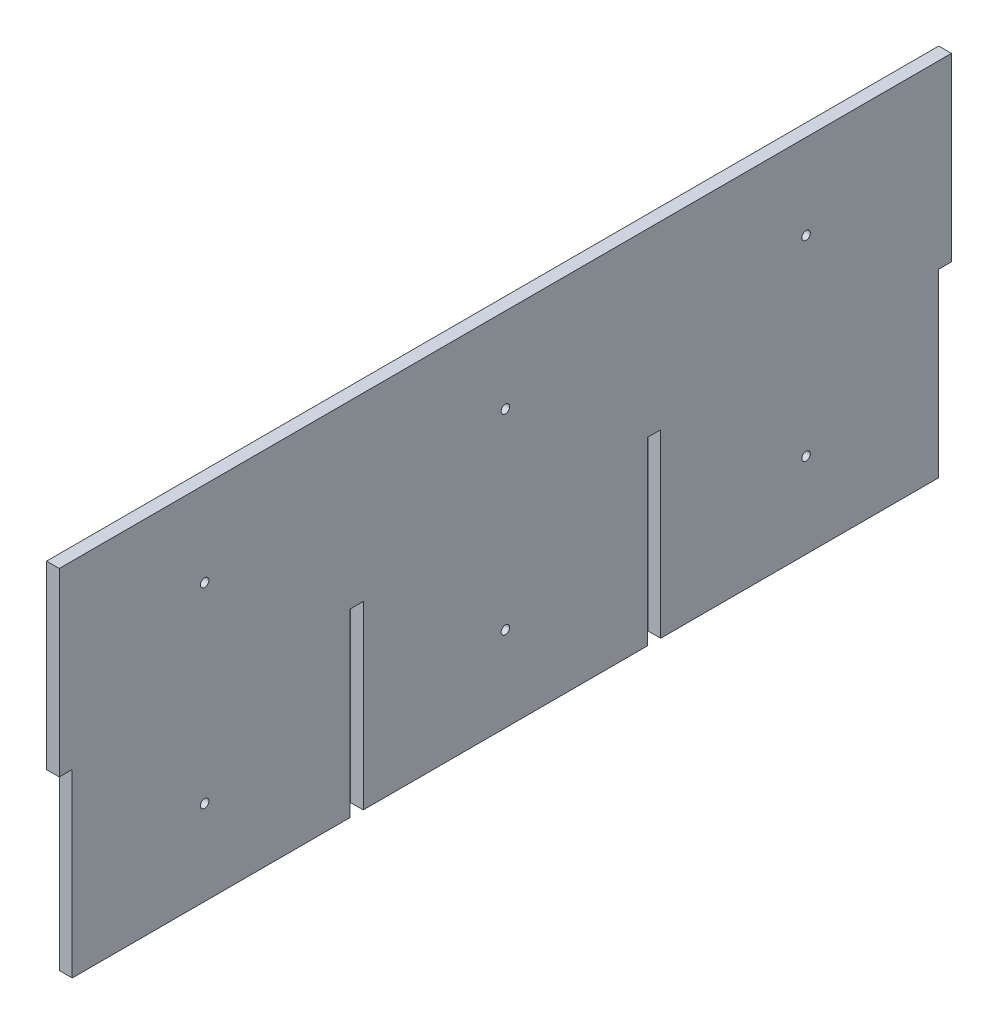
ISO-10303-21;
HEADER;
FILE_DESCRIPTION(('STEP AP214'),'2;1');
FILE_NAME('part.step','',(''),(''),'','','');
FILE_SCHEMA(('AUTOMOTIVE_DESIGN { 1 0 10303 214 1 1 1 1 }'));
ENDSEC;
DATA;
#1=APPLICATION_CONTEXT('core data for automotive mechanical design processes');
#2=APPLICATION_PROTOCOL_DEFINITION('international standard','automotive_design',2000,#1);
#3=PRODUCT_CONTEXT('',#1,'mechanical');
#4=PRODUCT('Part','Part','',(#3));
#5=PRODUCT_RELATED_PRODUCT_CATEGORY('part','',(#4));
#6=PRODUCT_DEFINITION_FORMATION('','',#4);
#7=PRODUCT_DEFINITION_CONTEXT('part definition',#1,'design');
#8=PRODUCT_DEFINITION('design','',#6,#7);
#9=PRODUCT_DEFINITION_SHAPE('','',#8);
#10=(LENGTH_UNIT() NAMED_UNIT(*) SI_UNIT(.MILLI.,.METRE.));
#11=(NAMED_UNIT(*) PLANE_ANGLE_UNIT() SI_UNIT($,.RADIAN.));
#12=(NAMED_UNIT(*) SI_UNIT($,.STERADIAN.) SOLID_ANGLE_UNIT());
#13=UNCERTAINTY_MEASURE_WITH_UNIT(LENGTH_MEASURE(1.E-05),#10,'distance_accuracy_value','');
#14=(GEOMETRIC_REPRESENTATION_CONTEXT(3) GLOBAL_UNCERTAINTY_ASSIGNED_CONTEXT((#13)) GLOBAL_UNIT_ASSIGNED_CONTEXT((#10,
#11,#12)) REPRESENTATION_CONTEXT('',''));
#15=CARTESIAN_POINT('',(0.,0.,0.));
#16=DIRECTION('',(0.,0.,1.));
#17=DIRECTION('',(1.,0.,0.));
#18=AXIS2_PLACEMENT_3D('',#15,#16,#17);
#19=CARTESIAN_POINT('',(6.,246.915861829284,-230.911700257926));
#20=DIRECTION('',(0.,-1.,0.));
#21=DIRECTION('',(0.,0.,-1.));
#22=AXIS2_PLACEMENT_3D('',#19,#20,#21);
#23=PLANE('',#22);
#24=DIRECTION('',(-1.,0.,0.));
#25=VECTOR('',#24,1.);
#26=CARTESIAN_POINT('',(6.,246.915861829284,-230.911700257926));
#27=LINE('',#26,#25);
#28=CARTESIAN_POINT('',(6.,246.915861829284,-230.911700257926));
#29=VERTEX_POINT('',#28);
#30=CARTESIAN_POINT('',(0.,246.915861829284,-230.911700257926));
#31=VERTEX_POINT('',#30);
#32=EDGE_CURVE('E289',#29,#31,#27,.T.);
#33=ORIENTED_EDGE('',*,*,#32,.F.);
#34=DIRECTION('',(0.,0.,1.));
#35=VECTOR('',#34,1.);
#36=CARTESIAN_POINT('',(6.,246.915861829284,-230.911700257926));
#37=LINE('',#36,#35);
#38=CARTESIAN_POINT('',(6.,246.915861829284,-650.911700257926));
#39=VERTEX_POINT('',#38);
#40=EDGE_CURVE('E287',#39,#29,#37,.T.);
#41=ORIENTED_EDGE('',*,*,#40,.F.);
#42=DIRECTION('',(-1.,0.,0.));
#43=VECTOR('',#42,1.);
#44=CARTESIAN_POINT('',(6.,246.915861829284,-650.911700257926));
#45=LINE('',#44,#43);
#46=CARTESIAN_POINT('',(0.,246.915861829284,-650.911700257926));
#47=VERTEX_POINT('',#46);
#48=EDGE_CURVE('E299',#39,#47,#45,.T.);
#49=ORIENTED_EDGE('',*,*,#48,.T.);
#50=DIRECTION('',(0.,0.,1.));
#51=VECTOR('',#50,1.);
#52=CARTESIAN_POINT('',(0.,246.915861829284,-230.911700257926));
#53=LINE('',#52,#51);
#54=EDGE_CURVE('E282',#47,#31,#53,.T.);
#55=ORIENTED_EDGE('',*,*,#54,.T.);
#56=EDGE_LOOP('',(#33,#41,#49,#55));
#57=FACE_BOUND('',#56,.T.);
#58=ADVANCED_FACE('F33',(#57),#23,.F.);
#59=CARTESIAN_POINT('',(6.,76.915861829284,-230.911700257926));
#60=DIRECTION('',(0.,1.,0.));
#61=DIRECTION('',(0.,0.,1.));
#62=AXIS2_PLACEMENT_3D('',#59,#60,#61);
#63=PLANE('',#62);
#64=DIRECTION('',(0.,0.,-1.));
#65=VECTOR('',#64,1.);
#66=CARTESIAN_POINT('',(6.,76.915861829284,-230.911700257926));
#67=LINE('',#66,#65);
#68=CARTESIAN_POINT('',(6.,76.915861829284,-514.011700257926));
#69=VERTEX_POINT('',#68);
#70=CARTESIAN_POINT('',(6.,76.915861829284,-644.811700257926));
#71=VERTEX_POINT('',#70);
#72=EDGE_CURVE('E281',#69,#71,#67,.T.);
#73=ORIENTED_EDGE('',*,*,#72,.F.);
#74=DIRECTION('',(1.,0.,0.));
#75=VECTOR('',#74,1.);
#76=CARTESIAN_POINT('',(-107.,76.915861829284,-514.011700257926));
#77=LINE('',#76,#75);
#78=CARTESIAN_POINT('',(0.,76.915861829284,-514.011700257926));
#79=VERTEX_POINT('',#78);
#80=EDGE_CURVE('E11',#79,#69,#77,.T.);
#81=ORIENTED_EDGE('',*,*,#80,.F.);
#82=DIRECTION('',(0.,0.,-1.));
#83=VECTOR('',#82,1.);
#84=CARTESIAN_POINT('',(0.,76.915861829284,-230.911700257926));
#85=LINE('',#84,#83);
#86=CARTESIAN_POINT('',(0.,76.915861829284,-644.811700257926));
#87=VERTEX_POINT('',#86);
#88=EDGE_CURVE('E292',#79,#87,#85,.T.);
#89=ORIENTED_EDGE('',*,*,#88,.T.);
#90=DIRECTION('',(1.,0.,0.));
#91=VECTOR('',#90,1.);
#92=CARTESIAN_POINT('',(0.,76.915861829284,-644.811700257926));
#93=LINE('',#92,#91);
#94=EDGE_CURVE('E253',#87,#71,#93,.T.);
#95=ORIENTED_EDGE('',*,*,#94,.T.);
#96=EDGE_LOOP('',(#73,#81,#89,#95));
#97=FACE_BOUND('',#96,.T.);
#98=ADVANCED_FACE('F318',(#97),#63,.F.);
#99=CARTESIAN_POINT('',(0.,76.915861829284,-237.011700257926));
#100=VERTEX_POINT('',#99);
#101=CARTESIAN_POINT('',(0.,76.915861829284,-367.811700257926));
#102=VERTEX_POINT('',#101);
#103=EDGE_CURVE('E48',#100,#102,#85,.T.);
#104=ORIENTED_EDGE('',*,*,#103,.T.);
#105=DIRECTION('',(-1.,0.,0.));
#106=VECTOR('',#105,1.);
#107=CARTESIAN_POINT('',(-107.,76.915861829284,-367.811700257926));
#108=LINE('',#107,#106);
#109=CARTESIAN_POINT('',(6.,76.915861829284,-367.811700257926));
#110=VERTEX_POINT('',#109);
#111=EDGE_CURVE('E170',#110,#102,#108,.T.);
#112=ORIENTED_EDGE('',*,*,#111,.F.);
#113=CARTESIAN_POINT('',(6.,76.915861829284,-237.011700257926));
#114=VERTEX_POINT('',#113);
#115=EDGE_CURVE('E283',#114,#110,#67,.T.);
#116=ORIENTED_EDGE('',*,*,#115,.F.);
#117=DIRECTION('',(1.,0.,0.));
#118=VECTOR('',#117,1.);
#119=CARTESIAN_POINT('',(0.,76.915861829284,-237.011700257926));
#120=LINE('',#119,#118);
#121=EDGE_CURVE('E267',#100,#114,#120,.T.);
#122=ORIENTED_EDGE('',*,*,#121,.F.);
#123=EDGE_LOOP('',(#104,#112,#116,#122));
#124=FACE_BOUND('',#123,.T.);
#125=ADVANCED_FACE('F347',(#124),#63,.F.);
#126=CARTESIAN_POINT('',(6.,76.915861829284,-230.911700257926));
#127=DIRECTION('',(0.,0.,-1.));
#128=DIRECTION('',(-1.,0.,0.));
#129=AXIS2_PLACEMENT_3D('',#126,#127,#128);
#130=PLANE('',#129);
#131=DIRECTION('',(0.,-1.,0.));
#132=VECTOR('',#131,1.);
#133=CARTESIAN_POINT('',(0.,76.915861829284,-230.911700257926));
#134=LINE('',#133,#132);
#135=CARTESIAN_POINT('',(0.,161.915861829284,-230.911700257926));
#136=VERTEX_POINT('',#135);
#137=EDGE_CURVE('E274',#31,#136,#134,.T.);
#138=ORIENTED_EDGE('',*,*,#137,.T.);
#139=DIRECTION('',(1.,0.,0.));
#140=VECTOR('',#139,1.);
#141=CARTESIAN_POINT('',(0.,161.915861829284,-230.911700257926));
#142=LINE('',#141,#140);
#143=CARTESIAN_POINT('',(6.,161.915861829284,-230.911700257926));
#144=VERTEX_POINT('',#143);
#145=EDGE_CURVE('E271',#136,#144,#142,.T.);
#146=ORIENTED_EDGE('',*,*,#145,.T.);
#147=DIRECTION('',(0.,-1.,0.));
#148=VECTOR('',#147,1.);
#149=CARTESIAN_POINT('',(6.,76.915861829284,-230.911700257926));
#150=LINE('',#149,#148);
#151=EDGE_CURVE('E278',#29,#144,#150,.T.);
#152=ORIENTED_EDGE('',*,*,#151,.F.);
#153=ORIENTED_EDGE('',*,*,#32,.T.);
#154=EDGE_LOOP('',(#138,#146,#152,#153));
#155=FACE_BOUND('',#154,.T.);
#156=ADVANCED_FACE('F35',(#155),#130,.F.);
#157=CARTESIAN_POINT('',(6.,76.915861829284,-650.911700257926));
#158=DIRECTION('',(0.,0.,1.));
#159=DIRECTION('',(1.,0.,0.));
#160=AXIS2_PLACEMENT_3D('',#157,#158,#159);
#161=PLANE('',#160);
#162=DIRECTION('',(0.,1.,0.));
#163=VECTOR('',#162,1.);
#164=CARTESIAN_POINT('',(6.,76.915861829284,-650.911700257926));
#165=LINE('',#164,#163);
#166=CARTESIAN_POINT('',(6.,161.915861829284,-650.911700257926));
#167=VERTEX_POINT('',#166);
#168=EDGE_CURVE('E285',#167,#39,#165,.T.);
#169=ORIENTED_EDGE('',*,*,#168,.F.);
#170=DIRECTION('',(1.,0.,0.));
#171=VECTOR('',#170,1.);
#172=CARTESIAN_POINT('',(0.,161.915861829284,-650.911700257926));
#173=LINE('',#172,#171);
#174=CARTESIAN_POINT('',(0.,161.915861829284,-650.911700257926));
#175=VERTEX_POINT('',#174);
#176=EDGE_CURVE('E248',#175,#167,#173,.T.);
#177=ORIENTED_EDGE('',*,*,#176,.F.);
#178=DIRECTION('',(0.,1.,0.));
#179=VECTOR('',#178,1.);
#180=CARTESIAN_POINT('',(0.,76.915861829284,-650.911700257926));
#181=LINE('',#180,#179);
#182=EDGE_CURVE('E294',#175,#47,#181,.T.);
#183=ORIENTED_EDGE('',*,*,#182,.T.);
#184=ORIENTED_EDGE('',*,*,#48,.F.);
#185=EDGE_LOOP('',(#169,#177,#183,#184));
#186=FACE_BOUND('',#185,.T.);
#187=ADVANCED_FACE('F330',(#186),#161,.F.);
#188=CARTESIAN_POINT('',(6.,0.,0.));
#189=DIRECTION('',(-1.,0.,0.));
#190=DIRECTION('',(0.,0.,1.));
#191=AXIS2_PLACEMENT_3D('',#188,#189,#190);
#192=PLANE('',#191);
#193=ORIENTED_EDGE('',*,*,#115,.T.);
#194=DIRECTION('',(0.,-1.,0.));
#195=VECTOR('',#194,1.);
#196=CARTESIAN_POINT('',(6.,48.915861829284,-367.811700257926));
#197=LINE('',#196,#195);
#198=CARTESIAN_POINT('',(6.,161.915861829284,-367.811700257926));
#199=VERTEX_POINT('',#198);
#200=EDGE_CURVE('E187',#199,#110,#197,.T.);
#201=ORIENTED_EDGE('',*,*,#200,.F.);
#202=DIRECTION('',(0.,0.,1.));
#203=VECTOR('',#202,1.);
#204=CARTESIAN_POINT('',(6.,161.915861829284,-367.811700257926));
#205=LINE('',#204,#203);
#206=CARTESIAN_POINT('',(6.,161.915861829284,-374.011700257926));
#207=VERTEX_POINT('',#206);
#208=EDGE_CURVE('E191',#207,#199,#205,.T.);
#209=ORIENTED_EDGE('',*,*,#208,.F.);
#210=DIRECTION('',(0.,1.,0.));
#211=VECTOR('',#210,1.);
#212=CARTESIAN_POINT('',(6.,48.915861829284,-374.011700257926));
#213=LINE('',#212,#211);
#214=CARTESIAN_POINT('',(6.,76.915861829284,-374.011700257926));
#215=VERTEX_POINT('',#214);
#216=EDGE_CURVE('E163',#215,#207,#213,.T.);
#217=ORIENTED_EDGE('',*,*,#216,.F.);
#218=DIRECTION('',(0.,0.,1.));
#219=VECTOR('',#218,1.);
#220=CARTESIAN_POINT('',(6.,76.915861829284,-1250.91170025793));
#221=LINE('',#220,#219);
#222=CARTESIAN_POINT('',(6.,76.915861829284,-507.811700257926));
#223=VERTEX_POINT('',#222);
#224=EDGE_CURVE('E148',#223,#215,#221,.T.);
#225=ORIENTED_EDGE('',*,*,#224,.F.);
#226=DIRECTION('',(0.,-1.,0.));
#227=VECTOR('',#226,1.);
#228=CARTESIAN_POINT('',(6.,48.915861829284,-507.811700257926));
#229=LINE('',#228,#227);
#230=CARTESIAN_POINT('',(6.,161.915861829284,-507.811700257926));
#231=VERTEX_POINT('',#230);
#232=EDGE_CURVE('E161',#231,#223,#229,.T.);
#233=ORIENTED_EDGE('',*,*,#232,.F.);
#234=DIRECTION('',(0.,0.,1.));
#235=VECTOR('',#234,1.);
#236=CARTESIAN_POINT('',(6.,161.915861829284,-507.811700257926));
#237=LINE('',#236,#235);
#238=CARTESIAN_POINT('',(6.,161.915861829284,-514.011700257926));
#239=VERTEX_POINT('',#238);
#240=EDGE_CURVE('E172',#239,#231,#237,.T.);
#241=ORIENTED_EDGE('',*,*,#240,.F.);
#242=DIRECTION('',(0.,1.,0.));
#243=VECTOR('',#242,1.);
#244=CARTESIAN_POINT('',(6.,48.915861829284,-514.011700257926));
#245=LINE('',#244,#243);
#246=EDGE_CURVE('E169',#69,#239,#245,.T.);
#247=ORIENTED_EDGE('',*,*,#246,.F.);
#248=ORIENTED_EDGE('',*,*,#72,.T.);
#249=DIRECTION('',(0.,-1.,0.));
#250=VECTOR('',#249,1.);
#251=CARTESIAN_POINT('',(6.,161.915861829284,-644.811700257926));
#252=LINE('',#251,#250);
#253=CARTESIAN_POINT('',(6.,161.915861829284,-644.811700257926));
#254=VERTEX_POINT('',#253);
#255=EDGE_CURVE('E245',#254,#71,#252,.T.);
#256=ORIENTED_EDGE('',*,*,#255,.F.);
#257=DIRECTION('',(0.,0.,1.));
#258=VECTOR('',#257,1.);
#259=CARTESIAN_POINT('',(6.,161.915861829284,-650.911700257926));
#260=LINE('',#259,#258);
#261=EDGE_CURVE('E238',#167,#254,#260,.T.);
#262=ORIENTED_EDGE('',*,*,#261,.F.);
#263=ORIENTED_EDGE('',*,*,#168,.T.);
#264=ORIENTED_EDGE('',*,*,#40,.T.);
#265=ORIENTED_EDGE('',*,*,#151,.T.);
#266=DIRECTION('',(0.,0.,1.));
#267=VECTOR('',#266,1.);
#268=CARTESIAN_POINT('',(6.,161.915861829284,-230.911700257926));
#269=LINE('',#268,#267);
#270=CARTESIAN_POINT('',(6.,161.915861829284,-237.011700257926));
#271=VERTEX_POINT('',#270);
#272=EDGE_CURVE('E264',#271,#144,#269,.T.);
#273=ORIENTED_EDGE('',*,*,#272,.F.);
#274=DIRECTION('',(0.,1.,0.));
#275=VECTOR('',#274,1.);
#276=CARTESIAN_POINT('',(6.,161.915861829284,-237.011700257926));
#277=LINE('',#276,#275);
#278=EDGE_CURVE('E256',#114,#271,#277,.T.);
#279=ORIENTED_EDGE('',*,*,#278,.F.);
#280=EDGE_LOOP('',(#193,#201,#209,#217,#225,#233,#241,#247,#248,#256,#262,#263,#264,#265,#273,#279));
#281=FACE_BOUND('',#280,.T.);
#282=CARTESIAN_POINT('',(6.,116.915861829284,-440.911700257926));
#283=DIRECTION('',(1.,0.,0.));
#284=DIRECTION('',(0.,0.,-1.));
#285=AXIS2_PLACEMENT_3D('',#282,#283,#284);
#286=CIRCLE('',#285,2.);
#287=CARTESIAN_POINT('',(6.,116.915861829284,-442.911700257926));
#288=VERTEX_POINT('',#287);
#289=EDGE_CURVE('E204',#288,#288,#286,.T.);
#290=ORIENTED_EDGE('',*,*,#289,.F.);
#291=EDGE_LOOP('',(#290));
#292=FACE_BOUND('',#291,.T.);
#293=CARTESIAN_POINT('',(6.,116.915861829284,-582.461700257926));
#294=DIRECTION('',(1.,0.,0.));
#295=DIRECTION('',(0.,0.,-1.));
#296=AXIS2_PLACEMENT_3D('',#293,#294,#295);
#297=CIRCLE('',#296,2.);
#298=CARTESIAN_POINT('',(6.,116.915861829284,-584.461700257926));
#299=VERTEX_POINT('',#298);
#300=EDGE_CURVE('E215',#299,#299,#297,.T.);
#301=ORIENTED_EDGE('',*,*,#300,.F.);
#302=EDGE_LOOP('',(#301));
#303=FACE_BOUND('',#302,.T.);
#304=CARTESIAN_POINT('',(6.,206.915861829284,-582.461700257926));
#305=DIRECTION('',(1.,0.,0.));
#306=DIRECTION('',(0.,0.,-1.));
#307=AXIS2_PLACEMENT_3D('',#304,#305,#306);
#308=CIRCLE('',#307,2.);
#309=CARTESIAN_POINT('',(6.,206.915861829284,-584.461700257926));
#310=VERTEX_POINT('',#309);
#311=EDGE_CURVE('E209',#310,#310,#308,.T.);
#312=ORIENTED_EDGE('',*,*,#311,.F.);
#313=EDGE_LOOP('',(#312));
#314=FACE_BOUND('',#313,.T.);
#315=CARTESIAN_POINT('',(6.,206.915861829284,-440.911700257926));
#316=DIRECTION('',(1.,0.,0.));
#317=DIRECTION('',(0.,0.,-1.));
#318=AXIS2_PLACEMENT_3D('',#315,#316,#317);
#319=CIRCLE('',#318,2.);
#320=CARTESIAN_POINT('',(6.,206.915861829284,-442.911700257926));
#321=VERTEX_POINT('',#320);
#322=EDGE_CURVE('E208',#321,#321,#319,.T.);
#323=ORIENTED_EDGE('',*,*,#322,.F.);
#324=EDGE_LOOP('',(#323));
#325=FACE_BOUND('',#324,.T.);
#326=CARTESIAN_POINT('',(6.,116.915861829284,-299.361700257926));
#327=DIRECTION('',(1.,0.,0.));
#328=DIRECTION('',(0.,0.,-1.));
#329=AXIS2_PLACEMENT_3D('',#326,#327,#328);
#330=CIRCLE('',#329,2.);
#331=CARTESIAN_POINT('',(6.,116.915861829284,-301.361700257926));
#332=VERTEX_POINT('',#331);
#333=EDGE_CURVE('E227',#332,#332,#330,.T.);
#334=ORIENTED_EDGE('',*,*,#333,.F.);
#335=EDGE_LOOP('',(#334));
#336=FACE_BOUND('',#335,.T.);
#337=CARTESIAN_POINT('',(6.,206.915861829284,-299.361700257926));
#338=DIRECTION('',(1.,0.,0.));
#339=DIRECTION('',(0.,0.,-1.));
#340=AXIS2_PLACEMENT_3D('',#337,#338,#339);
#341=CIRCLE('',#340,2.);
#342=CARTESIAN_POINT('',(6.,206.915861829284,-301.361700257926));
#343=VERTEX_POINT('',#342);
#344=EDGE_CURVE('E226',#343,#343,#341,.T.);
#345=ORIENTED_EDGE('',*,*,#344,.F.);
#346=EDGE_LOOP('',(#345));
#347=FACE_BOUND('',#346,.T.);
#348=ADVANCED_FACE('F158',(#281,#292,#303,#314,#325,#336,#347),#192,.F.);
#349=CARTESIAN_POINT('',(0.,0.,0.));
#350=DIRECTION('',(-1.,0.,0.));
#351=DIRECTION('',(0.,0.,1.));
#352=AXIS2_PLACEMENT_3D('',#349,#350,#351);
#353=PLANE('',#352);
#354=DIRECTION('',(0.,1.,0.));
#355=VECTOR('',#354,1.);
#356=CARTESIAN_POINT('',(0.,0.,-367.811700257926));
#357=LINE('',#356,#355);
#358=CARTESIAN_POINT('',(0.,161.915861829284,-367.811700257926));
#359=VERTEX_POINT('',#358);
#360=EDGE_CURVE('E202',#102,#359,#357,.T.);
#361=ORIENTED_EDGE('',*,*,#360,.F.);
#362=ORIENTED_EDGE('',*,*,#103,.F.);
#363=DIRECTION('',(0.,1.,0.));
#364=VECTOR('',#363,1.);
#365=CARTESIAN_POINT('',(0.,161.915861829284,-237.011700257926));
#366=LINE('',#365,#364);
#367=CARTESIAN_POINT('',(0.,161.915861829284,-237.011700257926));
#368=VERTEX_POINT('',#367);
#369=EDGE_CURVE('E260',#100,#368,#366,.T.);
#370=ORIENTED_EDGE('',*,*,#369,.T.);
#371=DIRECTION('',(0.,0.,1.));
#372=VECTOR('',#371,1.);
#373=CARTESIAN_POINT('',(0.,161.915861829284,-230.911700257926));
#374=LINE('',#373,#372);
#375=EDGE_CURVE('E263',#368,#136,#374,.T.);
#376=ORIENTED_EDGE('',*,*,#375,.T.);
#377=ORIENTED_EDGE('',*,*,#137,.F.);
#378=ORIENTED_EDGE('',*,*,#54,.F.);
#379=ORIENTED_EDGE('',*,*,#182,.F.);
#380=DIRECTION('',(0.,0.,1.));
#381=VECTOR('',#380,1.);
#382=CARTESIAN_POINT('',(0.,161.915861829284,-650.911700257926));
#383=LINE('',#382,#381);
#384=CARTESIAN_POINT('',(0.,161.915861829284,-644.811700257926));
#385=VERTEX_POINT('',#384);
#386=EDGE_CURVE('E241',#175,#385,#383,.T.);
#387=ORIENTED_EDGE('',*,*,#386,.T.);
#388=DIRECTION('',(0.,-1.,0.));
#389=VECTOR('',#388,1.);
#390=CARTESIAN_POINT('',(0.,161.915861829284,-644.811700257926));
#391=LINE('',#390,#389);
#392=EDGE_CURVE('E244',#385,#87,#391,.T.);
#393=ORIENTED_EDGE('',*,*,#392,.T.);
#394=ORIENTED_EDGE('',*,*,#88,.F.);
#395=DIRECTION('',(0.,-1.,0.));
#396=VECTOR('',#395,1.);
#397=CARTESIAN_POINT('',(0.,0.,-514.011700257926));
#398=LINE('',#397,#396);
#399=CARTESIAN_POINT('',(0.,161.915861829284,-514.011700257926));
#400=VERTEX_POINT('',#399);
#401=EDGE_CURVE('E180',#400,#79,#398,.T.);
#402=ORIENTED_EDGE('',*,*,#401,.F.);
#403=DIRECTION('',(0.,0.,-1.));
#404=VECTOR('',#403,1.);
#405=CARTESIAN_POINT('',(0.,161.915861829284,0.));
#406=LINE('',#405,#404);
#407=CARTESIAN_POINT('',(0.,161.915861829284,-507.811700257926));
#408=VERTEX_POINT('',#407);
#409=EDGE_CURVE('E41',#408,#400,#406,.T.);
#410=ORIENTED_EDGE('',*,*,#409,.F.);
#411=DIRECTION('',(0.,1.,0.));
#412=VECTOR('',#411,1.);
#413=CARTESIAN_POINT('',(0.,0.,-507.811700257926));
#414=LINE('',#413,#412);
#415=CARTESIAN_POINT('',(0.,76.915861829284,-507.811700257926));
#416=VERTEX_POINT('',#415);
#417=EDGE_CURVE('E185',#416,#408,#414,.T.);
#418=ORIENTED_EDGE('',*,*,#417,.F.);
#419=DIRECTION('',(0.,0.,1.));
#420=VECTOR('',#419,1.);
#421=CARTESIAN_POINT('',(0.,76.915861829284,-1250.91170025793));
#422=LINE('',#421,#420);
#423=CARTESIAN_POINT('',(0.,76.915861829284,-374.011700257926));
#424=VERTEX_POINT('',#423);
#425=EDGE_CURVE('E56',#416,#424,#422,.T.);
#426=ORIENTED_EDGE('',*,*,#425,.T.);
#427=DIRECTION('',(0.,-1.,0.));
#428=VECTOR('',#427,1.);
#429=CARTESIAN_POINT('',(0.,0.,-374.011700257926));
#430=LINE('',#429,#428);
#431=CARTESIAN_POINT('',(0.,161.915861829284,-374.011700257926));
#432=VERTEX_POINT('',#431);
#433=EDGE_CURVE('E197',#432,#424,#430,.T.);
#434=ORIENTED_EDGE('',*,*,#433,.F.);
#435=DIRECTION('',(0.,0.,-1.));
#436=VECTOR('',#435,1.);
#437=CARTESIAN_POINT('',(0.,161.915861829284,0.));
#438=LINE('',#437,#436);
#439=EDGE_CURVE('E302',#359,#432,#438,.T.);
#440=ORIENTED_EDGE('',*,*,#439,.F.);
#441=EDGE_LOOP('',(#361,#362,#370,#376,#377,#378,#379,#387,#393,#394,#402,#410,#418,#426,#434,#440));
#442=FACE_BOUND('',#441,.T.);
#443=CARTESIAN_POINT('',(0.,116.915861829284,-440.911700257926));
#444=DIRECTION('',(1.,0.,0.));
#445=DIRECTION('',(0.,0.,-1.));
#446=AXIS2_PLACEMENT_3D('',#443,#444,#445);
#447=CIRCLE('',#446,2.);
#448=CARTESIAN_POINT('',(0.,116.915861829284,-442.911700257926));
#449=VERTEX_POINT('',#448);
#450=EDGE_CURVE('E218',#449,#449,#447,.T.);
#451=ORIENTED_EDGE('',*,*,#450,.T.);
#452=EDGE_LOOP('',(#451));
#453=FACE_BOUND('',#452,.T.);
#454=CARTESIAN_POINT('',(0.,116.915861829284,-582.461700257926));
#455=DIRECTION('',(1.,0.,0.));
#456=DIRECTION('',(0.,0.,-1.));
#457=AXIS2_PLACEMENT_3D('',#454,#455,#456);
#458=CIRCLE('',#457,2.);
#459=CARTESIAN_POINT('',(0.,116.915861829284,-584.461700257926));
#460=VERTEX_POINT('',#459);
#461=EDGE_CURVE('E212',#460,#460,#458,.T.);
#462=ORIENTED_EDGE('',*,*,#461,.T.);
#463=EDGE_LOOP('',(#462));
#464=FACE_BOUND('',#463,.T.);
#465=CARTESIAN_POINT('',(0.,206.915861829284,-582.461700257926));
#466=DIRECTION('',(1.,0.,0.));
#467=DIRECTION('',(0.,0.,-1.));
#468=AXIS2_PLACEMENT_3D('',#465,#466,#467);
#469=CIRCLE('',#468,2.);
#470=CARTESIAN_POINT('',(0.,206.915861829284,-584.461700257926));
#471=VERTEX_POINT('',#470);
#472=EDGE_CURVE('E205',#471,#471,#469,.T.);
#473=ORIENTED_EDGE('',*,*,#472,.T.);
#474=EDGE_LOOP('',(#473));
#475=FACE_BOUND('',#474,.T.);
#476=CARTESIAN_POINT('',(0.,206.915861829284,-440.911700257926));
#477=DIRECTION('',(1.,0.,0.));
#478=DIRECTION('',(0.,0.,-1.));
#479=AXIS2_PLACEMENT_3D('',#476,#477,#478);
#480=CIRCLE('',#479,2.);
#481=CARTESIAN_POINT('',(0.,206.915861829284,-442.911700257926));
#482=VERTEX_POINT('',#481);
#483=EDGE_CURVE('E230',#482,#482,#480,.T.);
#484=ORIENTED_EDGE('',*,*,#483,.T.);
#485=EDGE_LOOP('',(#484));
#486=FACE_BOUND('',#485,.T.);
#487=CARTESIAN_POINT('',(0.,116.915861829284,-299.361700257926));
#488=DIRECTION('',(1.,0.,0.));
#489=DIRECTION('',(0.,0.,-1.));
#490=AXIS2_PLACEMENT_3D('',#487,#488,#489);
#491=CIRCLE('',#490,2.);
#492=CARTESIAN_POINT('',(0.,116.915861829284,-301.361700257926));
#493=VERTEX_POINT('',#492);
#494=EDGE_CURVE('E223',#493,#493,#491,.T.);
#495=ORIENTED_EDGE('',*,*,#494,.T.);
#496=EDGE_LOOP('',(#495));
#497=FACE_BOUND('',#496,.T.);
#498=CARTESIAN_POINT('',(0.,206.915861829284,-299.361700257926));
#499=DIRECTION('',(1.,0.,0.));
#500=DIRECTION('',(0.,0.,-1.));
#501=AXIS2_PLACEMENT_3D('',#498,#499,#500);
#502=CIRCLE('',#501,2.);
#503=CARTESIAN_POINT('',(0.,206.915861829284,-301.361700257926));
#504=VERTEX_POINT('',#503);
#505=EDGE_CURVE('E235',#504,#504,#502,.T.);
#506=ORIENTED_EDGE('',*,*,#505,.T.);
#507=EDGE_LOOP('',(#506));
#508=FACE_BOUND('',#507,.T.);
#509=ADVANCED_FACE('F313',(#442,#453,#464,#475,#486,#497,#508),#353,.T.);
#510=CARTESIAN_POINT('',(0.,161.915861829284,-230.911700257926));
#511=DIRECTION('',(0.,1.,0.));
#512=DIRECTION('',(0.,0.,1.));
#513=AXIS2_PLACEMENT_3D('',#510,#511,#512);
#514=PLANE('',#513);
#515=ORIENTED_EDGE('',*,*,#272,.T.);
#516=ORIENTED_EDGE('',*,*,#145,.F.);
#517=ORIENTED_EDGE('',*,*,#375,.F.);
#518=DIRECTION('',(1.,0.,0.));
#519=VECTOR('',#518,1.);
#520=CARTESIAN_POINT('',(0.,161.915861829284,-237.011700257926));
#521=LINE('',#520,#519);
#522=EDGE_CURVE('E275',#368,#271,#521,.T.);
#523=ORIENTED_EDGE('',*,*,#522,.T.);
#524=EDGE_LOOP('',(#515,#516,#517,#523));
#525=FACE_BOUND('',#524,.T.);
#526=ADVANCED_FACE('F342',(#525),#514,.F.);
#527=CARTESIAN_POINT('',(0.,161.915861829284,-237.011700257926));
#528=DIRECTION('',(0.,0.,-1.));
#529=DIRECTION('',(0.,1.,0.));
#530=AXIS2_PLACEMENT_3D('',#527,#528,#529);
#531=PLANE('',#530);
#532=ORIENTED_EDGE('',*,*,#278,.T.);
#533=ORIENTED_EDGE('',*,*,#522,.F.);
#534=ORIENTED_EDGE('',*,*,#369,.F.);
#535=ORIENTED_EDGE('',*,*,#121,.T.);
#536=EDGE_LOOP('',(#532,#533,#534,#535));
#537=FACE_BOUND('',#536,.T.);
#538=ADVANCED_FACE('F345',(#537),#531,.F.);
#539=CARTESIAN_POINT('',(0.,161.915861829284,-644.811700257926));
#540=DIRECTION('',(0.,0.,1.));
#541=DIRECTION('',(1.,0.,0.));
#542=AXIS2_PLACEMENT_3D('',#539,#540,#541);
#543=PLANE('',#542);
#544=ORIENTED_EDGE('',*,*,#255,.T.);
#545=ORIENTED_EDGE('',*,*,#94,.F.);
#546=ORIENTED_EDGE('',*,*,#392,.F.);
#547=DIRECTION('',(1.,0.,0.));
#548=VECTOR('',#547,1.);
#549=CARTESIAN_POINT('',(0.,161.915861829284,-644.811700257926));
#550=LINE('',#549,#548);
#551=EDGE_CURVE('E257',#385,#254,#550,.T.);
#552=ORIENTED_EDGE('',*,*,#551,.T.);
#553=EDGE_LOOP('',(#544,#545,#546,#552));
#554=FACE_BOUND('',#553,.T.);
#555=ADVANCED_FACE('F322',(#554),#543,.F.);
#556=CARTESIAN_POINT('',(0.,161.915861829284,-650.911700257926));
#557=DIRECTION('',(0.,1.,0.));
#558=DIRECTION('',(0.,0.,1.));
#559=AXIS2_PLACEMENT_3D('',#556,#557,#558);
#560=PLANE('',#559);
#561=ORIENTED_EDGE('',*,*,#261,.T.);
#562=ORIENTED_EDGE('',*,*,#551,.F.);
#563=ORIENTED_EDGE('',*,*,#386,.F.);
#564=ORIENTED_EDGE('',*,*,#176,.T.);
#565=EDGE_LOOP('',(#561,#562,#563,#564));
#566=FACE_BOUND('',#565,.T.);
#567=ADVANCED_FACE('F325',(#566),#560,.F.);
#568=CARTESIAN_POINT('',(0.,206.915861829284,-299.361700257926));
#569=DIRECTION('',(1.,0.,0.));
#570=DIRECTION('',(0.,0.,-1.));
#571=AXIS2_PLACEMENT_3D('',#568,#569,#570);
#572=CYLINDRICAL_SURFACE('',#571,2.);
#573=ORIENTED_EDGE('',*,*,#505,.F.);
#574=EDGE_LOOP('',(#573));
#575=FACE_BOUND('',#574,.T.);
#576=ORIENTED_EDGE('',*,*,#344,.T.);
#577=EDGE_LOOP('',(#576));
#578=FACE_BOUND('',#577,.T.);
#579=ADVANCED_FACE('F487',(#575,#578),#572,.F.);
#580=CARTESIAN_POINT('',(0.,116.915861829284,-299.361700257926));
#581=DIRECTION('',(1.,0.,0.));
#582=DIRECTION('',(0.,0.,-1.));
#583=AXIS2_PLACEMENT_3D('',#580,#581,#582);
#584=CYLINDRICAL_SURFACE('',#583,2.);
#585=ORIENTED_EDGE('',*,*,#494,.F.);
#586=EDGE_LOOP('',(#585));
#587=FACE_BOUND('',#586,.T.);
#588=ORIENTED_EDGE('',*,*,#333,.T.);
#589=EDGE_LOOP('',(#588));
#590=FACE_BOUND('',#589,.T.);
#591=ADVANCED_FACE('F478',(#587,#590),#584,.F.);
#592=CARTESIAN_POINT('',(0.,206.915861829284,-440.911700257926));
#593=DIRECTION('',(1.,0.,0.));
#594=DIRECTION('',(0.,0.,-1.));
#595=AXIS2_PLACEMENT_3D('',#592,#593,#594);
#596=CYLINDRICAL_SURFACE('',#595,2.);
#597=ORIENTED_EDGE('',*,*,#483,.F.);
#598=EDGE_LOOP('',(#597));
#599=FACE_BOUND('',#598,.T.);
#600=ORIENTED_EDGE('',*,*,#322,.T.);
#601=EDGE_LOOP('',(#600));
#602=FACE_BOUND('',#601,.T.);
#603=ADVANCED_FACE('F469',(#599,#602),#596,.F.);
#604=CARTESIAN_POINT('',(0.,206.915861829284,-582.461700257926));
#605=DIRECTION('',(1.,0.,0.));
#606=DIRECTION('',(0.,0.,-1.));
#607=AXIS2_PLACEMENT_3D('',#604,#605,#606);
#608=CYLINDRICAL_SURFACE('',#607,2.);
#609=ORIENTED_EDGE('',*,*,#472,.F.);
#610=EDGE_LOOP('',(#609));
#611=FACE_BOUND('',#610,.T.);
#612=ORIENTED_EDGE('',*,*,#311,.T.);
#613=EDGE_LOOP('',(#612));
#614=FACE_BOUND('',#613,.T.);
#615=ADVANCED_FACE('F460',(#611,#614),#608,.F.);
#616=CARTESIAN_POINT('',(0.,116.915861829284,-582.461700257926));
#617=DIRECTION('',(1.,0.,0.));
#618=DIRECTION('',(0.,0.,-1.));
#619=AXIS2_PLACEMENT_3D('',#616,#617,#618);
#620=CYLINDRICAL_SURFACE('',#619,2.);
#621=ORIENTED_EDGE('',*,*,#461,.F.);
#622=EDGE_LOOP('',(#621));
#623=FACE_BOUND('',#622,.T.);
#624=ORIENTED_EDGE('',*,*,#300,.T.);
#625=EDGE_LOOP('',(#624));
#626=FACE_BOUND('',#625,.T.);
#627=ADVANCED_FACE('F451',(#623,#626),#620,.F.);
#628=CARTESIAN_POINT('',(0.,116.915861829284,-440.911700257926));
#629=DIRECTION('',(1.,0.,0.));
#630=DIRECTION('',(0.,0.,-1.));
#631=AXIS2_PLACEMENT_3D('',#628,#629,#630);
#632=CYLINDRICAL_SURFACE('',#631,2.);
#633=ORIENTED_EDGE('',*,*,#450,.F.);
#634=EDGE_LOOP('',(#633));
#635=FACE_BOUND('',#634,.T.);
#636=ORIENTED_EDGE('',*,*,#289,.T.);
#637=EDGE_LOOP('',(#636));
#638=FACE_BOUND('',#637,.T.);
#639=ADVANCED_FACE('F446',(#635,#638),#632,.F.);
#640=CARTESIAN_POINT('',(-107.,48.915861829284,-367.811700257926));
#641=DIRECTION('',(0.,0.,1.));
#642=DIRECTION('',(1.,0.,0.));
#643=AXIS2_PLACEMENT_3D('',#640,#641,#642);
#644=PLANE('',#643);
#645=ORIENTED_EDGE('',*,*,#200,.T.);
#646=ORIENTED_EDGE('',*,*,#111,.T.);
#647=ORIENTED_EDGE('',*,*,#360,.T.);
#648=DIRECTION('',(1.,0.,0.));
#649=VECTOR('',#648,1.);
#650=CARTESIAN_POINT('',(-107.,161.915861829284,-367.811700257926));
#651=LINE('',#650,#649);
#652=EDGE_CURVE('E195',#359,#199,#651,.T.);
#653=ORIENTED_EDGE('',*,*,#652,.T.);
#654=EDGE_LOOP('',(#645,#646,#647,#653));
#655=FACE_BOUND('',#654,.T.);
#656=ADVANCED_FACE('F350',(#655),#644,.F.);
#657=CARTESIAN_POINT('',(-107.,161.915861829284,-367.811700257926));
#658=DIRECTION('',(0.,1.,0.));
#659=DIRECTION('',(0.,0.,1.));
#660=AXIS2_PLACEMENT_3D('',#657,#658,#659);
#661=PLANE('',#660);
#662=ORIENTED_EDGE('',*,*,#439,.T.);
#663=DIRECTION('',(1.,0.,0.));
#664=VECTOR('',#663,1.);
#665=CARTESIAN_POINT('',(-107.,161.915861829284,-374.011700257926));
#666=LINE('',#665,#664);
#667=EDGE_CURVE('E194',#432,#207,#666,.T.);
#668=ORIENTED_EDGE('',*,*,#667,.T.);
#669=ORIENTED_EDGE('',*,*,#208,.T.);
#670=ORIENTED_EDGE('',*,*,#652,.F.);
#671=EDGE_LOOP('',(#662,#668,#669,#670));
#672=FACE_BOUND('',#671,.T.);
#673=ADVANCED_FACE('F354',(#672),#661,.F.);
#674=CARTESIAN_POINT('',(-107.,48.915861829284,-374.011700257926));
#675=DIRECTION('',(0.,0.,-1.));
#676=DIRECTION('',(-1.,0.,0.));
#677=AXIS2_PLACEMENT_3D('',#674,#675,#676);
#678=PLANE('',#677);
#679=ORIENTED_EDGE('',*,*,#433,.T.);
#680=DIRECTION('',(1.,0.,0.));
#681=VECTOR('',#680,1.);
#682=CARTESIAN_POINT('',(-107.,76.915861829284,-374.011700257926));
#683=LINE('',#682,#681);
#684=EDGE_CURVE('E153',#424,#215,#683,.T.);
#685=ORIENTED_EDGE('',*,*,#684,.T.);
#686=ORIENTED_EDGE('',*,*,#216,.T.);
#687=ORIENTED_EDGE('',*,*,#667,.F.);
#688=EDGE_LOOP('',(#679,#685,#686,#687));
#689=FACE_BOUND('',#688,.T.);
#690=ADVANCED_FACE('F358',(#689),#678,.F.);
#691=CARTESIAN_POINT('',(-107.,48.915861829284,-507.811700257926));
#692=DIRECTION('',(0.,0.,1.));
#693=DIRECTION('',(1.,0.,0.));
#694=AXIS2_PLACEMENT_3D('',#691,#692,#693);
#695=PLANE('',#694);
#696=ORIENTED_EDGE('',*,*,#232,.T.);
#697=DIRECTION('',(-1.,0.,0.));
#698=VECTOR('',#697,1.);
#699=CARTESIAN_POINT('',(-107.,76.915861829284,-507.811700257926));
#700=LINE('',#699,#698);
#701=EDGE_CURVE('E145',#223,#416,#700,.T.);
#702=ORIENTED_EDGE('',*,*,#701,.T.);
#703=ORIENTED_EDGE('',*,*,#417,.T.);
#704=DIRECTION('',(1.,0.,0.));
#705=VECTOR('',#704,1.);
#706=CARTESIAN_POINT('',(-107.,161.915861829284,-507.811700257926));
#707=LINE('',#706,#705);
#708=EDGE_CURVE('E167',#408,#231,#707,.T.);
#709=ORIENTED_EDGE('',*,*,#708,.T.);
#710=EDGE_LOOP('',(#696,#702,#703,#709));
#711=FACE_BOUND('',#710,.T.);
#712=ADVANCED_FACE('F165',(#711),#695,.F.);
#713=CARTESIAN_POINT('',(-107.,161.915861829284,-507.811700257926));
#714=DIRECTION('',(0.,1.,0.));
#715=DIRECTION('',(0.,0.,1.));
#716=AXIS2_PLACEMENT_3D('',#713,#714,#715);
#717=PLANE('',#716);
#718=ORIENTED_EDGE('',*,*,#409,.T.);
#719=DIRECTION('',(1.,0.,0.));
#720=VECTOR('',#719,1.);
#721=CARTESIAN_POINT('',(-107.,161.915861829284,-514.011700257926));
#722=LINE('',#721,#720);
#723=EDGE_CURVE('E178',#400,#239,#722,.T.);
#724=ORIENTED_EDGE('',*,*,#723,.T.);
#725=ORIENTED_EDGE('',*,*,#240,.T.);
#726=ORIENTED_EDGE('',*,*,#708,.F.);
#727=EDGE_LOOP('',(#718,#724,#725,#726));
#728=FACE_BOUND('',#727,.T.);
#729=ADVANCED_FACE('F306',(#728),#717,.F.);
#730=CARTESIAN_POINT('',(-107.,48.915861829284,-514.011700257926));
#731=DIRECTION('',(0.,0.,-1.));
#732=DIRECTION('',(-1.,0.,0.));
#733=AXIS2_PLACEMENT_3D('',#730,#731,#732);
#734=PLANE('',#733);
#735=ORIENTED_EDGE('',*,*,#401,.T.);
#736=ORIENTED_EDGE('',*,*,#80,.T.);
#737=ORIENTED_EDGE('',*,*,#246,.T.);
#738=ORIENTED_EDGE('',*,*,#723,.F.);
#739=EDGE_LOOP('',(#735,#736,#737,#738));
#740=FACE_BOUND('',#739,.T.);
#741=ADVANCED_FACE('F310',(#740),#734,.F.);
#742=CARTESIAN_POINT('',(0.,76.915861829284,-1250.91170025793));
#743=DIRECTION('',(0.,1.,0.));
#744=DIRECTION('',(0.,0.,1.));
#745=AXIS2_PLACEMENT_3D('',#742,#743,#744);
#746=PLANE('',#745);
#747=ORIENTED_EDGE('',*,*,#425,.F.);
#748=ORIENTED_EDGE('',*,*,#701,.F.);
#749=ORIENTED_EDGE('',*,*,#224,.T.);
#750=ORIENTED_EDGE('',*,*,#684,.F.);
#751=EDGE_LOOP('',(#747,#748,#749,#750));
#752=FACE_BOUND('',#751,.T.);
#753=ADVANCED_FACE('F147',(#752),#746,.F.);
#754=CLOSED_SHELL('',(#58,#98,#125,#156,#187,#348,#509,#526,#538,#555,#567,#579,#591,#603,#615,
#627,#639,#656,#673,#690,#712,#729,#741,#753));
#755=MANIFOLD_SOLID_BREP('B2',#754);
#756=ADVANCED_BREP_SHAPE_REPRESENTATION('',(#18,#755),#14);
#757=SHAPE_DEFINITION_REPRESENTATION(#9,#756);
ENDSEC;
END-ISO-10303-21;
